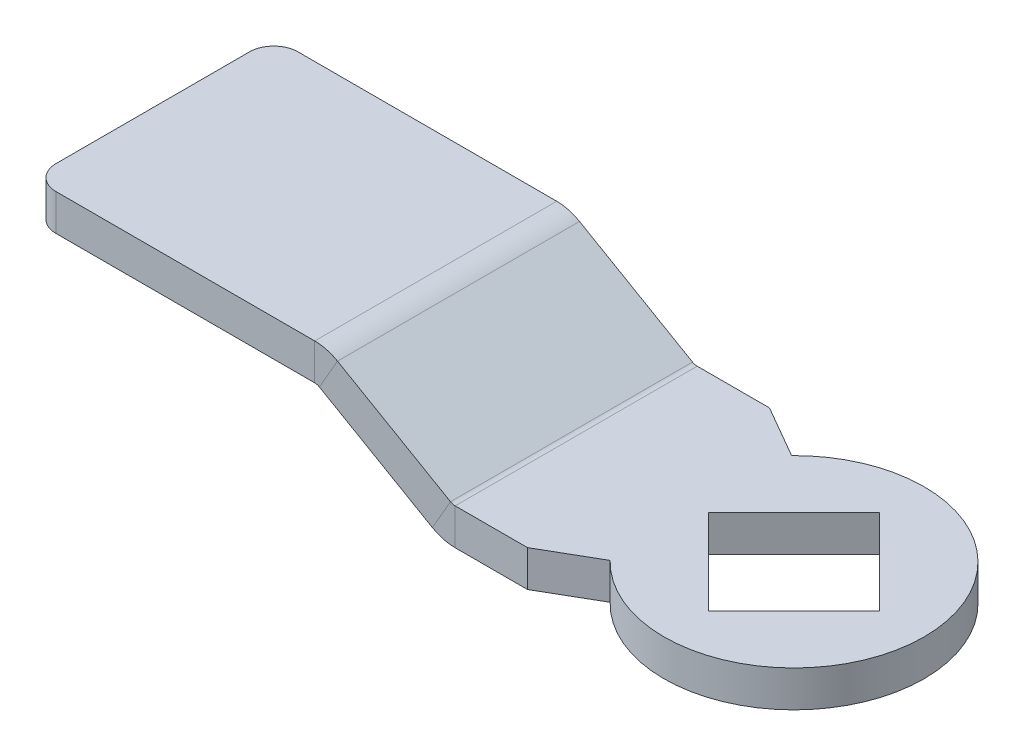
ISO-10303-21;
HEADER;
FILE_DESCRIPTION(('STEP AP214'),'2;1');
FILE_NAME('part.step','',(''),(''),'','','');
FILE_SCHEMA(('AUTOMOTIVE_DESIGN { 1 0 10303 214 1 1 1 1 }'));
ENDSEC;
DATA;
#1=APPLICATION_CONTEXT('core data for automotive mechanical design processes');
#2=APPLICATION_PROTOCOL_DEFINITION('international standard','automotive_design',2000,#1);
#3=PRODUCT_CONTEXT('',#1,'mechanical');
#4=PRODUCT('Part','Part','',(#3));
#5=PRODUCT_RELATED_PRODUCT_CATEGORY('part','',(#4));
#6=PRODUCT_DEFINITION_FORMATION('','',#4);
#7=PRODUCT_DEFINITION_CONTEXT('part definition',#1,'design');
#8=PRODUCT_DEFINITION('design','',#6,#7);
#9=PRODUCT_DEFINITION_SHAPE('','',#8);
#10=(LENGTH_UNIT() NAMED_UNIT(*) SI_UNIT(.MILLI.,.METRE.));
#11=(NAMED_UNIT(*) PLANE_ANGLE_UNIT() SI_UNIT($,.RADIAN.));
#12=(NAMED_UNIT(*) SI_UNIT($,.STERADIAN.) SOLID_ANGLE_UNIT());
#13=UNCERTAINTY_MEASURE_WITH_UNIT(LENGTH_MEASURE(1.E-05),#10,'distance_accuracy_value','');
#14=(GEOMETRIC_REPRESENTATION_CONTEXT(3) GLOBAL_UNCERTAINTY_ASSIGNED_CONTEXT((#13)) GLOBAL_UNIT_ASSIGNED_CONTEXT((#10,
#11,#12)) REPRESENTATION_CONTEXT('',''));
#15=CARTESIAN_POINT('',(0.,0.,0.));
#16=DIRECTION('',(0.,0.,1.));
#17=DIRECTION('',(1.,0.,0.));
#18=AXIS2_PLACEMENT_3D('',#15,#16,#17);
#19=CARTESIAN_POINT('',(-3.26800766572052,-12.0923274370223,0.));
#20=DIRECTION('',(0.500000000000001,0.866025403784438,0.));
#21=DIRECTION('',(0.,0.,1.));
#22=AXIS2_PLACEMENT_3D('',#19,#20,#21);
#23=PLANE('',#22);
#24=DIRECTION('',(0.866025403784438,-0.500000000000001,0.));
#25=VECTOR('',#24,1.);
#26=CARTESIAN_POINT('',(-49.1673540662957,14.4076725629777,10.));
#27=LINE('',#26,#25);
#28=CARTESIAN_POINT('',(-29.2307954420266,2.89729507454116,10.));
#29=VERTEX_POINT('',#28);
#30=CARTESIAN_POINT('',(-19.8904233174846,-2.49537128589446,10.));
#31=VERTEX_POINT('',#30);
#32=EDGE_CURVE('E347',#29,#31,#27,.T.);
#33=ORIENTED_EDGE('',*,*,#32,.F.);
#34=DIRECTION('',(0.,0.,-1.));
#35=VECTOR('',#34,1.);
#36=CARTESIAN_POINT('',(-29.2307954420266,2.89729507454116,0.));
#37=LINE('',#36,#35);
#38=CARTESIAN_POINT('',(-29.2307954420266,2.89729507454116,-9.99999999999999));
#39=VERTEX_POINT('',#38);
#40=EDGE_CURVE('E333',#29,#39,#37,.T.);
#41=ORIENTED_EDGE('',*,*,#40,.T.);
#42=DIRECTION('',(-0.866025403784438,0.500000000000001,0.));
#43=VECTOR('',#42,1.);
#44=CARTESIAN_POINT('',(-49.1673540662957,14.4076725629777,-10.));
#45=LINE('',#44,#43);
#46=CARTESIAN_POINT('',(-19.8904233174846,-2.49537128589446,-10.));
#47=VERTEX_POINT('',#46);
#48=EDGE_CURVE('E277',#47,#39,#45,.T.);
#49=ORIENTED_EDGE('',*,*,#48,.F.);
#50=DIRECTION('',(0.,0.,-1.));
#51=VECTOR('',#50,1.);
#52=CARTESIAN_POINT('',(-19.8904233174846,-2.49537128589446,0.));
#53=LINE('',#52,#51);
#54=EDGE_CURVE('E321',#31,#47,#53,.T.);
#55=ORIENTED_EDGE('',*,*,#54,.F.);
#56=EDGE_LOOP('',(#33,#41,#49,#55));
#57=FACE_BOUND('',#56,.T.);
#58=ADVANCED_FACE('F43',(#57),#23,.F.);
#59=CARTESIAN_POINT('',(-49.1673540662957,14.4076725629777,-10.));
#60=DIRECTION('',(0.,0.,-1.));
#61=DIRECTION('',(-0.866025403784438,0.500000000000001,0.));
#62=AXIS2_PLACEMENT_3D('',#59,#60,#61);
#63=PLANE('',#62);
#64=DIRECTION('',(-0.500000000000001,-0.866025403784438,0.));
#65=VECTOR('',#64,1.);
#66=CARTESIAN_POINT('',(-29.2307954420266,2.89729507454116,-10.));
#67=LINE('',#66,#65);
#68=CARTESIAN_POINT('',(-27.7307954420266,5.49537128589447,-10.));
#69=VERTEX_POINT('',#68);
#70=EDGE_CURVE('E342',#69,#39,#67,.T.);
#71=ORIENTED_EDGE('',*,*,#70,.F.);
#72=DIRECTION('',(-0.866025403784438,0.500000000000001,0.));
#73=VECTOR('',#72,1.);
#74=CARTESIAN_POINT('',(-47.6673540662957,17.005748774331,-10.));
#75=LINE('',#74,#73);
#76=CARTESIAN_POINT('',(-18.3904233174846,0.102704925458851,-10.));
#77=VERTEX_POINT('',#76);
#78=EDGE_CURVE('E325',#77,#69,#75,.T.);
#79=ORIENTED_EDGE('',*,*,#78,.F.);
#80=DIRECTION('',(-0.500000000000001,-0.866025403784438,0.));
#81=VECTOR('',#80,1.);
#82=CARTESIAN_POINT('',(-19.8904233174846,-2.49537128589446,-10.));
#83=LINE('',#82,#81);
#84=EDGE_CURVE('E324',#77,#47,#83,.T.);
#85=ORIENTED_EDGE('',*,*,#84,.T.);
#86=ORIENTED_EDGE('',*,*,#48,.T.);
#87=EDGE_LOOP('',(#71,#79,#85,#86));
#88=FACE_BOUND('',#87,.T.);
#89=ADVANCED_FACE('F404',(#88),#63,.T.);
#90=CARTESIAN_POINT('',(-49.1673540662957,14.4076725629777,10.));
#91=DIRECTION('',(0.,0.,1.));
#92=DIRECTION('',(0.866025403784438,-0.500000000000001,0.));
#93=AXIS2_PLACEMENT_3D('',#90,#91,#92);
#94=PLANE('',#93);
#95=DIRECTION('',(0.500000000000001,0.866025403784438,0.));
#96=VECTOR('',#95,1.);
#97=CARTESIAN_POINT('',(-29.2307954420266,2.89729507454116,10.));
#98=LINE('',#97,#96);
#99=CARTESIAN_POINT('',(-27.7307954420266,5.49537128589447,10.));
#100=VERTEX_POINT('',#99);
#101=EDGE_CURVE('E336',#29,#100,#98,.T.);
#102=ORIENTED_EDGE('',*,*,#101,.F.);
#103=ORIENTED_EDGE('',*,*,#32,.T.);
#104=DIRECTION('',(0.500000000000001,0.866025403784438,0.));
#105=VECTOR('',#104,1.);
#106=CARTESIAN_POINT('',(-19.8904233174846,-2.49537128589446,10.));
#107=LINE('',#106,#105);
#108=CARTESIAN_POINT('',(-18.3904233174846,0.102704925458851,10.));
#109=VERTEX_POINT('',#108);
#110=EDGE_CURVE('E330',#31,#109,#107,.T.);
#111=ORIENTED_EDGE('',*,*,#110,.T.);
#112=DIRECTION('',(0.866025403784438,-0.500000000000001,0.));
#113=VECTOR('',#112,1.);
#114=CARTESIAN_POINT('',(-47.6673540662957,17.005748774331,10.));
#115=LINE('',#114,#113);
#116=EDGE_CURVE('E349',#100,#109,#115,.T.);
#117=ORIENTED_EDGE('',*,*,#116,.F.);
#118=EDGE_LOOP('',(#102,#103,#111,#117));
#119=FACE_BOUND('',#118,.T.);
#120=ADVANCED_FACE('F394',(#119),#94,.T.);
#121=CARTESIAN_POINT('',(-1.76800766572051,-9.49425122566903,0.));
#122=DIRECTION('',(0.500000000000001,0.866025403784438,0.));
#123=DIRECTION('',(0.,0.,1.));
#124=AXIS2_PLACEMENT_3D('',#121,#122,#123);
#125=PLANE('',#124);
#126=DIRECTION('',(0.,0.,-1.));
#127=VECTOR('',#126,1.);
#128=CARTESIAN_POINT('',(-27.7307954420266,5.49537128589447,0.));
#129=LINE('',#128,#127);
#130=EDGE_CURVE('E339',#100,#69,#129,.T.);
#131=ORIENTED_EDGE('',*,*,#130,.F.);
#132=ORIENTED_EDGE('',*,*,#116,.T.);
#133=DIRECTION('',(0.,0.,-1.));
#134=VECTOR('',#133,1.);
#135=CARTESIAN_POINT('',(-18.3904233174846,0.102704925458851,0.));
#136=LINE('',#135,#134);
#137=EDGE_CURVE('E327',#109,#77,#136,.T.);
#138=ORIENTED_EDGE('',*,*,#137,.T.);
#139=ORIENTED_EDGE('',*,*,#78,.T.);
#140=EDGE_LOOP('',(#131,#132,#138,#139));
#141=FACE_BOUND('',#140,.T.);
#142=ADVANCED_FACE('F400',(#141),#125,.T.);
#143=CARTESIAN_POINT('',(-12.0315879192969,-3.,9.99999999999999));
#144=DIRECTION('',(0.500000000000001,0.,0.866025403784438));
#145=DIRECTION('',(0.866025403784438,0.,-0.500000000000001));
#146=AXIS2_PLACEMENT_3D('',#143,#144,#145);
#147=PLANE('',#146);
#148=DIRECTION('',(0.866025403784438,0.,-0.500000000000001));
#149=VECTOR('',#148,1.);
#150=CARTESIAN_POINT('',(-12.0315879192969,0.,9.99999999999999));
#151=LINE('',#150,#149);
#152=CARTESIAN_POINT('',(-12.0315879192969,0.,9.99999999999999));
#153=VERTEX_POINT('',#152);
#154=CARTESIAN_POINT('',(-7.70146090037469,0.,7.5));
#155=VERTEX_POINT('',#154);
#156=EDGE_CURVE('E288',#153,#155,#151,.T.);
#157=ORIENTED_EDGE('',*,*,#156,.F.);
#158=DIRECTION('',(0.,1.,0.));
#159=VECTOR('',#158,1.);
#160=CARTESIAN_POINT('',(-12.0315879192969,-3.,9.99999999999999));
#161=LINE('',#160,#159);
#162=CARTESIAN_POINT('',(-12.0315879192969,-3.,9.99999999999999));
#163=VERTEX_POINT('',#162);
#164=EDGE_CURVE('E274',#163,#153,#161,.T.);
#165=ORIENTED_EDGE('',*,*,#164,.F.);
#166=DIRECTION('',(0.866025403784438,0.,-0.500000000000001));
#167=VECTOR('',#166,1.);
#168=CARTESIAN_POINT('',(-12.0315879192969,-3.,9.99999999999999));
#169=LINE('',#168,#167);
#170=CARTESIAN_POINT('',(-7.70146090037469,-3.,7.5));
#171=VERTEX_POINT('',#170);
#172=EDGE_CURVE('E310',#163,#171,#169,.T.);
#173=ORIENTED_EDGE('',*,*,#172,.T.);
#174=DIRECTION('',(0.,1.,0.));
#175=VECTOR('',#174,1.);
#176=CARTESIAN_POINT('',(-7.70146090037469,-3.,7.5));
#177=LINE('',#176,#175);
#178=EDGE_CURVE('E308',#171,#155,#177,.T.);
#179=ORIENTED_EDGE('',*,*,#178,.T.);
#180=EDGE_LOOP('',(#157,#165,#173,#179));
#181=FACE_BOUND('',#180,.T.);
#182=ADVANCED_FACE('F440',(#181),#147,.T.);
#183=CARTESIAN_POINT('',(0.,-3.,0.));
#184=DIRECTION('',(0.,1.,0.));
#185=DIRECTION('',(0.,0.,1.));
#186=AXIS2_PLACEMENT_3D('',#183,#184,#185);
#187=CYLINDRICAL_SURFACE('',#186,10.75);
#188=CARTESIAN_POINT('',(0.,0.,0.));
#189=DIRECTION('',(0.,1.,0.));
#190=DIRECTION('',(0.,0.,1.));
#191=AXIS2_PLACEMENT_3D('',#188,#189,#190);
#192=CIRCLE('',#191,10.75);
#193=CARTESIAN_POINT('',(-7.70146090037469,0.,-7.49999999999999));
#194=VERTEX_POINT('',#193);
#195=EDGE_CURVE('E285',#155,#194,#192,.T.);
#196=ORIENTED_EDGE('',*,*,#195,.F.);
#197=ORIENTED_EDGE('',*,*,#178,.F.);
#198=CARTESIAN_POINT('',(0.,-3.,0.));
#199=DIRECTION('',(0.,1.,0.));
#200=DIRECTION('',(0.,0.,1.));
#201=AXIS2_PLACEMENT_3D('',#198,#199,#200);
#202=CIRCLE('',#201,10.75);
#203=CARTESIAN_POINT('',(-7.70146090037469,-3.,-7.49999999999999));
#204=VERTEX_POINT('',#203);
#205=EDGE_CURVE('E305',#171,#204,#202,.T.);
#206=ORIENTED_EDGE('',*,*,#205,.T.);
#207=DIRECTION('',(0.,1.,0.));
#208=VECTOR('',#207,1.);
#209=CARTESIAN_POINT('',(-7.70146090037469,-3.,-7.49999999999999));
#210=LINE('',#209,#208);
#211=EDGE_CURVE('E303',#204,#194,#210,.T.);
#212=ORIENTED_EDGE('',*,*,#211,.T.);
#213=EDGE_LOOP('',(#196,#197,#206,#212));
#214=FACE_BOUND('',#213,.T.);
#215=ADVANCED_FACE('F437',(#214),#187,.T.);
#216=CARTESIAN_POINT('',(-12.0315879192969,-3.,-9.99999999999999));
#217=DIRECTION('',(0.500000000000001,0.,-0.866025403784438));
#218=DIRECTION('',(-0.866025403784438,0.,-0.500000000000001));
#219=AXIS2_PLACEMENT_3D('',#216,#217,#218);
#220=PLANE('',#219);
#221=DIRECTION('',(-0.866025403784438,0.,-0.500000000000001));
#222=VECTOR('',#221,1.);
#223=CARTESIAN_POINT('',(-12.0315879192969,0.,-9.99999999999999));
#224=LINE('',#223,#222);
#225=CARTESIAN_POINT('',(-12.0315879192969,0.,-9.99999999999999));
#226=VERTEX_POINT('',#225);
#227=EDGE_CURVE('E282',#194,#226,#224,.T.);
#228=ORIENTED_EDGE('',*,*,#227,.F.);
#229=ORIENTED_EDGE('',*,*,#211,.F.);
#230=DIRECTION('',(-0.866025403784438,0.,-0.500000000000001));
#231=VECTOR('',#230,1.);
#232=CARTESIAN_POINT('',(-12.0315879192969,-3.,-9.99999999999999));
#233=LINE('',#232,#231);
#234=CARTESIAN_POINT('',(-12.0315879192969,-3.,-9.99999999999999));
#235=VERTEX_POINT('',#234);
#236=EDGE_CURVE('E300',#204,#235,#233,.T.);
#237=ORIENTED_EDGE('',*,*,#236,.T.);
#238=DIRECTION('',(0.,1.,0.));
#239=VECTOR('',#238,1.);
#240=CARTESIAN_POINT('',(-12.0315879192969,-3.,-9.99999999999999));
#241=LINE('',#240,#239);
#242=EDGE_CURVE('E298',#235,#226,#241,.T.);
#243=ORIENTED_EDGE('',*,*,#242,.T.);
#244=EDGE_LOOP('',(#228,#229,#237,#243));
#245=FACE_BOUND('',#244,.T.);
#246=ADVANCED_FACE('F433',(#245),#220,.T.);
#247=CARTESIAN_POINT('',(0.,-3.,0.));
#248=DIRECTION('',(0.,1.,0.));
#249=DIRECTION('',(0.,0.,1.));
#250=AXIS2_PLACEMENT_3D('',#247,#248,#249);
#251=PLANE('',#250);
#252=DIRECTION('',(0.707106781186548,0.,-0.707106781186548));
#253=VECTOR('',#252,1.);
#254=CARTESIAN_POINT('',(0.,-3.,7.07106781186547));
#255=LINE('',#254,#253);
#256=CARTESIAN_POINT('',(0.,-3.,7.07106781186547));
#257=VERTEX_POINT('',#256);
#258=CARTESIAN_POINT('',(7.07106781186548,-3.,0.));
#259=VERTEX_POINT('',#258);
#260=EDGE_CURVE('E192',#257,#259,#255,.T.);
#261=ORIENTED_EDGE('',*,*,#260,.T.);
#262=DIRECTION('',(-0.707106781186548,0.,-0.707106781186548));
#263=VECTOR('',#262,1.);
#264=CARTESIAN_POINT('',(7.07106781186548,-3.,0.));
#265=LINE('',#264,#263);
#266=CARTESIAN_POINT('',(0.,-3.,-7.07106781186548));
#267=VERTEX_POINT('',#266);
#268=EDGE_CURVE('E184',#259,#267,#265,.T.);
#269=ORIENTED_EDGE('',*,*,#268,.T.);
#270=DIRECTION('',(-0.707106781186548,0.,0.707106781186548));
#271=VECTOR('',#270,1.);
#272=CARTESIAN_POINT('',(0.,-3.,-7.07106781186548));
#273=LINE('',#272,#271);
#274=CARTESIAN_POINT('',(-7.07106781186548,-3.,0.));
#275=VERTEX_POINT('',#274);
#276=EDGE_CURVE('E196',#267,#275,#273,.T.);
#277=ORIENTED_EDGE('',*,*,#276,.T.);
#278=DIRECTION('',(0.707106781186548,0.,0.707106781186548));
#279=VECTOR('',#278,1.);
#280=CARTESIAN_POINT('',(-7.07106781186548,-3.,0.));
#281=LINE('',#280,#279);
#282=EDGE_CURVE('E200',#275,#257,#281,.T.);
#283=ORIENTED_EDGE('',*,*,#282,.T.);
#284=EDGE_LOOP('',(#261,#269,#277,#283));
#285=FACE_BOUND('',#284,.T.);
#286=DIRECTION('',(1.,0.,0.));
#287=VECTOR('',#286,1.);
#288=CARTESIAN_POINT('',(-53.,-3.,10.));
#289=LINE('',#288,#287);
#290=CARTESIAN_POINT('',(-18.0071233174846,-3.,9.99999999999999));
#291=VERTEX_POINT('',#290);
#292=EDGE_CURVE('E278',#291,#163,#289,.T.);
#293=ORIENTED_EDGE('',*,*,#292,.F.);
#294=DIRECTION('',(0.,0.,-1.));
#295=VECTOR('',#294,1.);
#296=CARTESIAN_POINT('',(-18.0071233174846,-3.,0.));
#297=LINE('',#296,#295);
#298=CARTESIAN_POINT('',(-18.0071233174846,-3.,-9.99999999999999));
#299=VERTEX_POINT('',#298);
#300=EDGE_CURVE('E295',#291,#299,#297,.T.);
#301=ORIENTED_EDGE('',*,*,#300,.T.);
#302=DIRECTION('',(-1.,0.,0.));
#303=VECTOR('',#302,1.);
#304=CARTESIAN_POINT('',(-53.,-3.,-10.));
#305=LINE('',#304,#303);
#306=EDGE_CURVE('E293',#235,#299,#305,.T.);
#307=ORIENTED_EDGE('',*,*,#306,.F.);
#308=ORIENTED_EDGE('',*,*,#236,.F.);
#309=ORIENTED_EDGE('',*,*,#205,.F.);
#310=ORIENTED_EDGE('',*,*,#172,.F.);
#311=EDGE_LOOP('',(#293,#301,#307,#308,#309,#310));
#312=FACE_BOUND('',#311,.T.);
#313=ADVANCED_FACE('F202',(#285,#312),#251,.F.);
#314=CARTESIAN_POINT('',(-53.,-3.,-10.));
#315=DIRECTION('',(0.,0.,-1.));
#316=DIRECTION('',(-1.,0.,0.));
#317=AXIS2_PLACEMENT_3D('',#314,#315,#316);
#318=PLANE('',#317);
#319=DIRECTION('',(0.,-1.,0.));
#320=VECTOR('',#319,1.);
#321=CARTESIAN_POINT('',(-18.0071233174846,-3.,-9.99999999999999));
#322=LINE('',#321,#320);
#323=CARTESIAN_POINT('',(-18.0071233174846,0.,-9.99999999999999));
#324=VERTEX_POINT('',#323);
#325=EDGE_CURVE('E313',#324,#299,#322,.T.);
#326=ORIENTED_EDGE('',*,*,#325,.F.);
#327=DIRECTION('',(-1.,0.,0.));
#328=VECTOR('',#327,1.);
#329=CARTESIAN_POINT('',(-53.,0.,-10.));
#330=LINE('',#329,#328);
#331=EDGE_CURVE('E280',#226,#324,#330,.T.);
#332=ORIENTED_EDGE('',*,*,#331,.F.);
#333=ORIENTED_EDGE('',*,*,#242,.F.);
#334=ORIENTED_EDGE('',*,*,#306,.T.);
#335=EDGE_LOOP('',(#326,#332,#333,#334));
#336=FACE_BOUND('',#335,.T.);
#337=ADVANCED_FACE('F430',(#336),#318,.T.);
#338=CARTESIAN_POINT('',(0.,0.,0.));
#339=DIRECTION('',(0.,1.,0.));
#340=DIRECTION('',(0.,0.,1.));
#341=AXIS2_PLACEMENT_3D('',#338,#339,#340);
#342=PLANE('',#341);
#343=DIRECTION('',(-0.707106781186548,0.,-0.707106781186548));
#344=VECTOR('',#343,1.);
#345=CARTESIAN_POINT('',(7.07106781186548,0.,0.));
#346=LINE('',#345,#344);
#347=CARTESIAN_POINT('',(7.07106781186548,0.,0.));
#348=VERTEX_POINT('',#347);
#349=CARTESIAN_POINT('',(0.,0.,-7.07106781186548));
#350=VERTEX_POINT('',#349);
#351=EDGE_CURVE('E187',#348,#350,#346,.T.);
#352=ORIENTED_EDGE('',*,*,#351,.F.);
#353=DIRECTION('',(0.707106781186548,0.,-0.707106781186548));
#354=VECTOR('',#353,1.);
#355=CARTESIAN_POINT('',(0.,0.,7.07106781186547));
#356=LINE('',#355,#354);
#357=CARTESIAN_POINT('',(0.,0.,7.07106781186547));
#358=VERTEX_POINT('',#357);
#359=EDGE_CURVE('E205',#358,#348,#356,.T.);
#360=ORIENTED_EDGE('',*,*,#359,.F.);
#361=DIRECTION('',(0.707106781186548,0.,0.707106781186548));
#362=VECTOR('',#361,1.);
#363=CARTESIAN_POINT('',(-7.07106781186548,0.,0.));
#364=LINE('',#363,#362);
#365=CARTESIAN_POINT('',(-7.07106781186548,0.,0.));
#366=VERTEX_POINT('',#365);
#367=EDGE_CURVE('E208',#366,#358,#364,.T.);
#368=ORIENTED_EDGE('',*,*,#367,.F.);
#369=DIRECTION('',(-0.707106781186548,0.,0.707106781186548));
#370=VECTOR('',#369,1.);
#371=CARTESIAN_POINT('',(0.,0.,-7.07106781186548));
#372=LINE('',#371,#370);
#373=EDGE_CURVE('E214',#350,#366,#372,.T.);
#374=ORIENTED_EDGE('',*,*,#373,.F.);
#375=EDGE_LOOP('',(#352,#360,#368,#374));
#376=FACE_BOUND('',#375,.T.);
#377=DIRECTION('',(0.,0.,-1.));
#378=VECTOR('',#377,1.);
#379=CARTESIAN_POINT('',(-18.0071233174846,0.,0.));
#380=LINE('',#379,#378);
#381=CARTESIAN_POINT('',(-18.0071233174846,0.,9.99999999999999));
#382=VERTEX_POINT('',#381);
#383=EDGE_CURVE('E316',#382,#324,#380,.T.);
#384=ORIENTED_EDGE('',*,*,#383,.F.);
#385=DIRECTION('',(1.,0.,0.));
#386=VECTOR('',#385,1.);
#387=CARTESIAN_POINT('',(-53.,0.,10.));
#388=LINE('',#387,#386);
#389=EDGE_CURVE('E291',#382,#153,#388,.T.);
#390=ORIENTED_EDGE('',*,*,#389,.T.);
#391=ORIENTED_EDGE('',*,*,#156,.T.);
#392=ORIENTED_EDGE('',*,*,#195,.T.);
#393=ORIENTED_EDGE('',*,*,#227,.T.);
#394=ORIENTED_EDGE('',*,*,#331,.T.);
#395=EDGE_LOOP('',(#384,#390,#391,#392,#393,#394));
#396=FACE_BOUND('',#395,.T.);
#397=ADVANCED_FACE('F448',(#376,#396),#342,.T.);
#398=CARTESIAN_POINT('',(-53.,-3.,10.));
#399=DIRECTION('',(0.,0.,1.));
#400=DIRECTION('',(1.,0.,0.));
#401=AXIS2_PLACEMENT_3D('',#398,#399,#400);
#402=PLANE('',#401);
#403=DIRECTION('',(0.,1.,0.));
#404=VECTOR('',#403,1.);
#405=CARTESIAN_POINT('',(-18.0071233174846,-3.,9.99999999999999));
#406=LINE('',#405,#404);
#407=EDGE_CURVE('E269',#291,#382,#406,.T.);
#408=ORIENTED_EDGE('',*,*,#407,.F.);
#409=ORIENTED_EDGE('',*,*,#292,.T.);
#410=ORIENTED_EDGE('',*,*,#164,.T.);
#411=ORIENTED_EDGE('',*,*,#389,.F.);
#412=EDGE_LOOP('',(#408,#409,#410,#411));
#413=FACE_BOUND('',#412,.T.);
#414=ADVANCED_FACE('F443',(#413),#402,.T.);
#415=CARTESIAN_POINT('',(-18.0071233174846,0.7666,9.99999999999999));
#416=DIRECTION('',(0.,0.,1.));
#417=DIRECTION('',(1.,0.,0.));
#418=AXIS2_PLACEMENT_3D('',#415,#416,#417);
#419=PLANE('',#418);
#420=ORIENTED_EDGE('',*,*,#407,.T.);
#421=CARTESIAN_POINT('',(-18.0071233174846,0.7666,9.99999999999999));
#422=DIRECTION('',(0.,0.,-1.));
#423=DIRECTION('',(-1.,0.,0.));
#424=AXIS2_PLACEMENT_3D('',#421,#422,#423);
#425=CIRCLE('',#424,0.7666);
#426=EDGE_CURVE('E257',#382,#109,#425,.T.);
#427=ORIENTED_EDGE('',*,*,#426,.T.);
#428=ORIENTED_EDGE('',*,*,#110,.F.);
#429=CARTESIAN_POINT('',(-18.0071233174846,0.7666,9.99999999999999));
#430=DIRECTION('',(0.,0.,-1.));
#431=DIRECTION('',(1.,0.,0.));
#432=AXIS2_PLACEMENT_3D('',#429,#430,#431);
#433=CIRCLE('',#432,3.7666);
#434=EDGE_CURVE('E262',#291,#31,#433,.T.);
#435=ORIENTED_EDGE('',*,*,#434,.F.);
#436=EDGE_LOOP('',(#420,#427,#428,#435));
#437=FACE_BOUND('',#436,.T.);
#438=ADVANCED_FACE('F416',(#437),#419,.T.);
#439=CARTESIAN_POINT('',(-18.0071233174846,0.7666,-9.99999999999999));
#440=DIRECTION('',(0.,0.,-1.));
#441=DIRECTION('',(-1.,0.,0.));
#442=AXIS2_PLACEMENT_3D('',#439,#440,#441);
#443=PLANE('',#442);
#444=ORIENTED_EDGE('',*,*,#84,.F.);
#445=CARTESIAN_POINT('',(-18.0071233174846,0.7666,-10.));
#446=DIRECTION('',(0.,0.,-1.));
#447=DIRECTION('',(-1.,0.,0.));
#448=AXIS2_PLACEMENT_3D('',#445,#446,#447);
#449=CIRCLE('',#448,0.7666);
#450=EDGE_CURVE('E266',#77,#324,#449,.F.);
#451=ORIENTED_EDGE('',*,*,#450,.T.);
#452=ORIENTED_EDGE('',*,*,#325,.T.);
#453=CARTESIAN_POINT('',(-18.0071233174846,0.7666,-9.99999999999999));
#454=DIRECTION('',(0.,0.,1.));
#455=DIRECTION('',(-1.,0.,0.));
#456=AXIS2_PLACEMENT_3D('',#453,#454,#455);
#457=CIRCLE('',#456,3.7666);
#458=EDGE_CURVE('E265',#47,#299,#457,.T.);
#459=ORIENTED_EDGE('',*,*,#458,.F.);
#460=EDGE_LOOP('',(#444,#451,#452,#459));
#461=FACE_BOUND('',#460,.T.);
#462=ADVANCED_FACE('F426',(#461),#443,.T.);
#463=CARTESIAN_POINT('',(-18.0071233174846,0.7666,20.2585406210411));
#464=DIRECTION('',(0.,0.,-1.));
#465=DIRECTION('',(-1.,0.,0.));
#466=AXIS2_PLACEMENT_3D('',#463,#464,#465);
#467=CYLINDRICAL_SURFACE('',#466,3.7666);
#468=ORIENTED_EDGE('',*,*,#458,.T.);
#469=ORIENTED_EDGE('',*,*,#300,.F.);
#470=ORIENTED_EDGE('',*,*,#434,.T.);
#471=ORIENTED_EDGE('',*,*,#54,.T.);
#472=EDGE_LOOP('',(#468,#469,#470,#471));
#473=FACE_BOUND('',#472,.T.);
#474=ADVANCED_FACE('F419',(#473),#467,.T.);
#475=CARTESIAN_POINT('',(-18.0071233174846,0.7666,20.2585406210411));
#476=DIRECTION('',(0.,0.,-1.));
#477=DIRECTION('',(-1.,0.,0.));
#478=AXIS2_PLACEMENT_3D('',#475,#476,#477);
#479=CYLINDRICAL_SURFACE('',#478,0.7666);
#480=ORIENTED_EDGE('',*,*,#450,.F.);
#481=ORIENTED_EDGE('',*,*,#137,.F.);
#482=ORIENTED_EDGE('',*,*,#426,.F.);
#483=ORIENTED_EDGE('',*,*,#383,.T.);
#484=EDGE_LOOP('',(#480,#481,#482,#483));
#485=FACE_BOUND('',#484,.T.);
#486=ADVANCED_FACE('F446',(#485),#479,.F.);
#487=CARTESIAN_POINT('',(-29.6140954420266,2.23340000000001,10.));
#488=DIRECTION('',(0.,0.,-1.));
#489=DIRECTION('',(-1.,0.,0.));
#490=AXIS2_PLACEMENT_3D('',#487,#488,#489);
#491=PLANE('',#490);
#492=ORIENTED_EDGE('',*,*,#101,.T.);
#493=CARTESIAN_POINT('',(-29.6140954420266,2.23340000000001,10.));
#494=DIRECTION('',(0.,0.,-1.));
#495=DIRECTION('',(-1.,0.,0.));
#496=AXIS2_PLACEMENT_3D('',#493,#494,#495);
#497=CIRCLE('',#496,3.7666);
#498=CARTESIAN_POINT('',(-29.6140954420266,6.00000000000001,10.));
#499=VERTEX_POINT('',#498);
#500=EDGE_CURVE('E227',#100,#499,#497,.F.);
#501=ORIENTED_EDGE('',*,*,#500,.T.);
#502=DIRECTION('',(0.,1.,0.));
#503=VECTOR('',#502,1.);
#504=CARTESIAN_POINT('',(-29.6140954420266,3.00000000000001,10.));
#505=LINE('',#504,#503);
#506=CARTESIAN_POINT('',(-29.6140954420266,3.00000000000001,10.));
#507=VERTEX_POINT('',#506);
#508=EDGE_CURVE('E241',#507,#499,#505,.T.);
#509=ORIENTED_EDGE('',*,*,#508,.F.);
#510=CARTESIAN_POINT('',(-29.6140954420266,2.23340000000001,10.));
#511=DIRECTION('',(0.,0.,1.));
#512=DIRECTION('',(-1.,0.,0.));
#513=AXIS2_PLACEMENT_3D('',#510,#511,#512);
#514=CIRCLE('',#513,0.7666);
#515=EDGE_CURVE('E250',#29,#507,#514,.T.);
#516=ORIENTED_EDGE('',*,*,#515,.F.);
#517=EDGE_LOOP('',(#492,#501,#509,#516));
#518=FACE_BOUND('',#517,.T.);
#519=ADVANCED_FACE('F390',(#518),#491,.F.);
#520=CARTESIAN_POINT('',(-29.6140954420266,2.23340000000001,-9.99999999999999));
#521=DIRECTION('',(0.,0.,1.));
#522=DIRECTION('',(1.,0.,0.));
#523=AXIS2_PLACEMENT_3D('',#520,#521,#522);
#524=PLANE('',#523);
#525=DIRECTION('',(0.,-1.,0.));
#526=VECTOR('',#525,1.);
#527=CARTESIAN_POINT('',(-29.6140954420266,3.00000000000001,-10.));
#528=LINE('',#527,#526);
#529=CARTESIAN_POINT('',(-29.6140954420266,6.00000000000001,-10.));
#530=VERTEX_POINT('',#529);
#531=CARTESIAN_POINT('',(-29.6140954420266,3.00000000000001,-9.99999999999999));
#532=VERTEX_POINT('',#531);
#533=EDGE_CURVE('E228',#530,#532,#528,.T.);
#534=ORIENTED_EDGE('',*,*,#533,.F.);
#535=CARTESIAN_POINT('',(-29.6140954420266,2.23340000000001,-9.99999999999999));
#536=DIRECTION('',(0.,0.,-1.));
#537=DIRECTION('',(-1.,0.,0.));
#538=AXIS2_PLACEMENT_3D('',#535,#536,#537);
#539=CIRCLE('',#538,3.7666);
#540=EDGE_CURVE('E254',#530,#69,#539,.T.);
#541=ORIENTED_EDGE('',*,*,#540,.T.);
#542=ORIENTED_EDGE('',*,*,#70,.T.);
#543=CARTESIAN_POINT('',(-29.6140954420266,2.23340000000001,-9.99999999999999));
#544=DIRECTION('',(0.,0.,-1.));
#545=DIRECTION('',(1.,0.,0.));
#546=AXIS2_PLACEMENT_3D('',#543,#544,#545);
#547=CIRCLE('',#546,0.7666);
#548=EDGE_CURVE('E253',#532,#39,#547,.T.);
#549=ORIENTED_EDGE('',*,*,#548,.F.);
#550=EDGE_LOOP('',(#534,#541,#542,#549));
#551=FACE_BOUND('',#550,.T.);
#552=ADVANCED_FACE('F408',(#551),#524,.F.);
#553=CARTESIAN_POINT('',(-29.6140954420266,2.23340000000001,20.4101740451382));
#554=DIRECTION('',(0.,0.,-1.));
#555=DIRECTION('',(-1.,0.,0.));
#556=AXIS2_PLACEMENT_3D('',#553,#554,#555);
#557=CYLINDRICAL_SURFACE('',#556,0.7666);
#558=ORIENTED_EDGE('',*,*,#548,.T.);
#559=ORIENTED_EDGE('',*,*,#40,.F.);
#560=ORIENTED_EDGE('',*,*,#515,.T.);
#561=DIRECTION('',(0.,0.,-1.));
#562=VECTOR('',#561,1.);
#563=CARTESIAN_POINT('',(-29.6140954420266,3.00000000000001,0.));
#564=LINE('',#563,#562);
#565=EDGE_CURVE('E220',#507,#532,#564,.T.);
#566=ORIENTED_EDGE('',*,*,#565,.T.);
#567=EDGE_LOOP('',(#558,#559,#560,#566));
#568=FACE_BOUND('',#567,.T.);
#569=ADVANCED_FACE('F410',(#568),#557,.F.);
#570=CARTESIAN_POINT('',(-29.6140954420266,2.23340000000001,20.4101740451382));
#571=DIRECTION('',(0.,0.,-1.));
#572=DIRECTION('',(-1.,0.,0.));
#573=AXIS2_PLACEMENT_3D('',#570,#571,#572);
#574=CYLINDRICAL_SURFACE('',#573,3.7666);
#575=ORIENTED_EDGE('',*,*,#540,.F.);
#576=DIRECTION('',(0.,0.,-1.));
#577=VECTOR('',#576,1.);
#578=CARTESIAN_POINT('',(-29.6140954420266,6.00000000000001,0.));
#579=LINE('',#578,#577);
#580=EDGE_CURVE('E236',#499,#530,#579,.T.);
#581=ORIENTED_EDGE('',*,*,#580,.F.);
#582=ORIENTED_EDGE('',*,*,#500,.F.);
#583=ORIENTED_EDGE('',*,*,#130,.T.);
#584=EDGE_LOOP('',(#575,#581,#582,#583));
#585=FACE_BOUND('',#584,.T.);
#586=ADVANCED_FACE('F389',(#585),#574,.T.);
#587=CARTESIAN_POINT('',(-53.,3.,-10.));
#588=DIRECTION('',(-1.,0.,0.));
#589=DIRECTION('',(0.,0.,1.));
#590=AXIS2_PLACEMENT_3D('',#587,#588,#589);
#591=PLANE('',#590);
#592=DIRECTION('',(0.,0.,1.));
#593=VECTOR('',#592,1.);
#594=CARTESIAN_POINT('',(-53.,6.00000000000001,-10.));
#595=LINE('',#594,#593);
#596=CARTESIAN_POINT('',(-53.,6.00000000000001,-8.));
#597=VERTEX_POINT('',#596);
#598=CARTESIAN_POINT('',(-53.,6.00000000000001,8.));
#599=VERTEX_POINT('',#598);
#600=EDGE_CURVE('E230',#597,#599,#595,.T.);
#601=ORIENTED_EDGE('',*,*,#600,.F.);
#602=DIRECTION('',(0.,1.,0.));
#603=VECTOR('',#602,1.);
#604=CARTESIAN_POINT('',(-53.,3.,-8.));
#605=LINE('',#604,#603);
#606=CARTESIAN_POINT('',(-53.,3.,-8.));
#607=VERTEX_POINT('',#606);
#608=EDGE_CURVE('E361',#597,#607,#605,.F.);
#609=ORIENTED_EDGE('',*,*,#608,.T.);
#610=DIRECTION('',(0.,0.,1.));
#611=VECTOR('',#610,1.);
#612=CARTESIAN_POINT('',(-53.,3.,-10.));
#613=LINE('',#612,#611);
#614=CARTESIAN_POINT('',(-53.,3.,8.));
#615=VERTEX_POINT('',#614);
#616=EDGE_CURVE('E246',#607,#615,#613,.T.);
#617=ORIENTED_EDGE('',*,*,#616,.T.);
#618=DIRECTION('',(0.,1.,0.));
#619=VECTOR('',#618,1.);
#620=CARTESIAN_POINT('',(-53.,3.,8.));
#621=LINE('',#620,#619);
#622=EDGE_CURVE('E358',#615,#599,#621,.T.);
#623=ORIENTED_EDGE('',*,*,#622,.T.);
#624=EDGE_LOOP('',(#601,#609,#617,#623));
#625=FACE_BOUND('',#624,.T.);
#626=ADVANCED_FACE('F378',(#625),#591,.T.);
#627=CARTESIAN_POINT('',(1.55193856587141,3.00000000000001,0.));
#628=DIRECTION('',(0.,1.,0.));
#629=DIRECTION('',(0.,0.,1.));
#630=AXIS2_PLACEMENT_3D('',#627,#628,#629);
#631=PLANE('',#630);
#632=ORIENTED_EDGE('',*,*,#616,.F.);
#633=CARTESIAN_POINT('',(-51.,3.00000000000001,-8.));
#634=DIRECTION('',(0.,1.,0.));
#635=DIRECTION('',(0.,0.,1.));
#636=AXIS2_PLACEMENT_3D('',#633,#634,#635);
#637=CIRCLE('',#636,2.);
#638=CARTESIAN_POINT('',(-51.,3.00000000000001,-10.));
#639=VERTEX_POINT('',#638);
#640=EDGE_CURVE('E51',#607,#639,#637,.F.);
#641=ORIENTED_EDGE('',*,*,#640,.T.);
#642=DIRECTION('',(-1.,0.,0.));
#643=VECTOR('',#642,1.);
#644=CARTESIAN_POINT('',(-51.4480614341286,3.00000000000001,-10.));
#645=LINE('',#644,#643);
#646=EDGE_CURVE('E224',#532,#639,#645,.T.);
#647=ORIENTED_EDGE('',*,*,#646,.F.);
#648=ORIENTED_EDGE('',*,*,#565,.F.);
#649=DIRECTION('',(1.,0.,0.));
#650=VECTOR('',#649,1.);
#651=CARTESIAN_POINT('',(-51.4480614341286,3.00000000000001,10.));
#652=LINE('',#651,#650);
#653=CARTESIAN_POINT('',(-51.,3.00000000000001,10.));
#654=VERTEX_POINT('',#653);
#655=EDGE_CURVE('E244',#654,#507,#652,.T.);
#656=ORIENTED_EDGE('',*,*,#655,.F.);
#657=CARTESIAN_POINT('',(-51.,3.00000000000001,8.));
#658=DIRECTION('',(0.,1.,0.));
#659=DIRECTION('',(0.,0.,1.));
#660=AXIS2_PLACEMENT_3D('',#657,#658,#659);
#661=CIRCLE('',#660,2.);
#662=EDGE_CURVE('E63',#654,#615,#661,.F.);
#663=ORIENTED_EDGE('',*,*,#662,.T.);
#664=EDGE_LOOP('',(#632,#641,#647,#648,#656,#663));
#665=FACE_BOUND('',#664,.T.);
#666=ADVANCED_FACE('F365',(#665),#631,.F.);
#667=CARTESIAN_POINT('',(-51.4480614341286,3.00000000000001,10.));
#668=DIRECTION('',(0.,0.,1.));
#669=DIRECTION('',(1.,0.,0.));
#670=AXIS2_PLACEMENT_3D('',#667,#668,#669);
#671=PLANE('',#670);
#672=DIRECTION('',(1.,0.,0.));
#673=VECTOR('',#672,1.);
#674=CARTESIAN_POINT('',(-51.4480614341286,6.00000000000001,10.));
#675=LINE('',#674,#673);
#676=CARTESIAN_POINT('',(-51.,6.00000000000001,10.));
#677=VERTEX_POINT('',#676);
#678=EDGE_CURVE('E239',#677,#499,#675,.T.);
#679=ORIENTED_EDGE('',*,*,#678,.F.);
#680=DIRECTION('',(0.,1.,0.));
#681=VECTOR('',#680,1.);
#682=CARTESIAN_POINT('',(-51.,3.00000000000001,10.));
#683=LINE('',#682,#681);
#684=EDGE_CURVE('E12',#677,#654,#683,.F.);
#685=ORIENTED_EDGE('',*,*,#684,.T.);
#686=ORIENTED_EDGE('',*,*,#655,.T.);
#687=ORIENTED_EDGE('',*,*,#508,.T.);
#688=EDGE_LOOP('',(#679,#685,#686,#687));
#689=FACE_BOUND('',#688,.T.);
#690=ADVANCED_FACE('F381',(#689),#671,.T.);
#691=CARTESIAN_POINT('',(1.55193856587142,6.00000000000001,0.));
#692=DIRECTION('',(0.,1.,0.));
#693=DIRECTION('',(0.,0.,1.));
#694=AXIS2_PLACEMENT_3D('',#691,#692,#693);
#695=PLANE('',#694);
#696=DIRECTION('',(-1.,0.,0.));
#697=VECTOR('',#696,1.);
#698=CARTESIAN_POINT('',(-51.4480614341286,6.00000000000001,-10.));
#699=LINE('',#698,#697);
#700=CARTESIAN_POINT('',(-51.,6.00000000000001,-10.));
#701=VERTEX_POINT('',#700);
#702=EDGE_CURVE('E233',#530,#701,#699,.T.);
#703=ORIENTED_EDGE('',*,*,#702,.T.);
#704=CARTESIAN_POINT('',(-51.,6.00000000000001,-8.));
#705=DIRECTION('',(0.,1.,0.));
#706=DIRECTION('',(0.,0.,1.));
#707=AXIS2_PLACEMENT_3D('',#704,#705,#706);
#708=CIRCLE('',#707,2.);
#709=EDGE_CURVE('E356',#701,#597,#708,.T.);
#710=ORIENTED_EDGE('',*,*,#709,.T.);
#711=ORIENTED_EDGE('',*,*,#600,.T.);
#712=CARTESIAN_POINT('',(-51.,6.00000000000001,8.));
#713=DIRECTION('',(0.,1.,0.));
#714=DIRECTION('',(0.,0.,1.));
#715=AXIS2_PLACEMENT_3D('',#712,#713,#714);
#716=CIRCLE('',#715,2.);
#717=EDGE_CURVE('E354',#599,#677,#716,.T.);
#718=ORIENTED_EDGE('',*,*,#717,.T.);
#719=ORIENTED_EDGE('',*,*,#678,.T.);
#720=ORIENTED_EDGE('',*,*,#580,.T.);
#721=EDGE_LOOP('',(#703,#710,#711,#718,#719,#720));
#722=FACE_BOUND('',#721,.T.);
#723=ADVANCED_FACE('F376',(#722),#695,.T.);
#724=CARTESIAN_POINT('',(-51.4480614341286,3.00000000000001,-10.));
#725=DIRECTION('',(0.,0.,-1.));
#726=DIRECTION('',(-1.,0.,0.));
#727=AXIS2_PLACEMENT_3D('',#724,#725,#726);
#728=PLANE('',#727);
#729=ORIENTED_EDGE('',*,*,#646,.T.);
#730=DIRECTION('',(0.,1.,0.));
#731=VECTOR('',#730,1.);
#732=CARTESIAN_POINT('',(-51.,3.00000000000001,-10.));
#733=LINE('',#732,#731);
#734=EDGE_CURVE('E345',#639,#701,#733,.T.);
#735=ORIENTED_EDGE('',*,*,#734,.T.);
#736=ORIENTED_EDGE('',*,*,#702,.F.);
#737=ORIENTED_EDGE('',*,*,#533,.T.);
#738=EDGE_LOOP('',(#729,#735,#736,#737));
#739=FACE_BOUND('',#738,.T.);
#740=ADVANCED_FACE('F371',(#739),#728,.T.);
#741=CARTESIAN_POINT('',(7.07106781186548,-3.,0.));
#742=DIRECTION('',(0.707106781186547,0.,-0.707106781186547));
#743=DIRECTION('',(-0.707106781186548,0.,-0.707106781186548));
#744=AXIS2_PLACEMENT_3D('',#741,#742,#743);
#745=PLANE('',#744);
#746=ORIENTED_EDGE('',*,*,#351,.T.);
#747=DIRECTION('',(0.,1.,0.));
#748=VECTOR('',#747,1.);
#749=CARTESIAN_POINT('',(0.,-3.,-7.07106781186548));
#750=LINE('',#749,#748);
#751=EDGE_CURVE('E180',#267,#350,#750,.T.);
#752=ORIENTED_EDGE('',*,*,#751,.F.);
#753=ORIENTED_EDGE('',*,*,#268,.F.);
#754=DIRECTION('',(0.,1.,0.));
#755=VECTOR('',#754,1.);
#756=CARTESIAN_POINT('',(7.07106781186548,-3.,0.));
#757=LINE('',#756,#755);
#758=EDGE_CURVE('E218',#259,#348,#757,.T.);
#759=ORIENTED_EDGE('',*,*,#758,.T.);
#760=EDGE_LOOP('',(#746,#752,#753,#759));
#761=FACE_BOUND('',#760,.T.);
#762=ADVANCED_FACE('F182',(#761),#745,.F.);
#763=CARTESIAN_POINT('',(0.,-3.,7.07106781186547));
#764=DIRECTION('',(0.707106781186547,0.,0.707106781186547));
#765=DIRECTION('',(0.707106781186548,0.,-0.707106781186548));
#766=AXIS2_PLACEMENT_3D('',#763,#764,#765);
#767=PLANE('',#766);
#768=ORIENTED_EDGE('',*,*,#359,.T.);
#769=ORIENTED_EDGE('',*,*,#758,.F.);
#770=ORIENTED_EDGE('',*,*,#260,.F.);
#771=DIRECTION('',(0.,1.,0.));
#772=VECTOR('',#771,1.);
#773=CARTESIAN_POINT('',(0.,-3.,7.07106781186547));
#774=LINE('',#773,#772);
#775=EDGE_CURVE('E221',#257,#358,#774,.T.);
#776=ORIENTED_EDGE('',*,*,#775,.T.);
#777=EDGE_LOOP('',(#768,#769,#770,#776));
#778=FACE_BOUND('',#777,.T.);
#779=ADVANCED_FACE('F478',(#778),#767,.F.);
#780=CARTESIAN_POINT('',(-7.07106781186548,-3.,0.));
#781=DIRECTION('',(-0.707106781186547,0.,0.707106781186547));
#782=DIRECTION('',(0.707106781186548,0.,0.707106781186548));
#783=AXIS2_PLACEMENT_3D('',#780,#781,#782);
#784=PLANE('',#783);
#785=ORIENTED_EDGE('',*,*,#367,.T.);
#786=ORIENTED_EDGE('',*,*,#775,.F.);
#787=ORIENTED_EDGE('',*,*,#282,.F.);
#788=DIRECTION('',(0.,1.,0.));
#789=VECTOR('',#788,1.);
#790=CARTESIAN_POINT('',(-7.07106781186548,-3.,0.));
#791=LINE('',#790,#789);
#792=EDGE_CURVE('E191',#275,#366,#791,.T.);
#793=ORIENTED_EDGE('',*,*,#792,.T.);
#794=EDGE_LOOP('',(#785,#786,#787,#793));
#795=FACE_BOUND('',#794,.T.);
#796=ADVANCED_FACE('F473',(#795),#784,.F.);
#797=CARTESIAN_POINT('',(0.,-3.,-7.07106781186548));
#798=DIRECTION('',(-0.707106781186547,0.,-0.707106781186547));
#799=DIRECTION('',(-0.707106781186548,0.,0.707106781186548));
#800=AXIS2_PLACEMENT_3D('',#797,#798,#799);
#801=PLANE('',#800);
#802=ORIENTED_EDGE('',*,*,#373,.T.);
#803=ORIENTED_EDGE('',*,*,#792,.F.);
#804=ORIENTED_EDGE('',*,*,#276,.F.);
#805=ORIENTED_EDGE('',*,*,#751,.T.);
#806=EDGE_LOOP('',(#802,#803,#804,#805));
#807=FACE_BOUND('',#806,.T.);
#808=ADVANCED_FACE('F197',(#807),#801,.F.);
#809=CARTESIAN_POINT('',(-51.,3.00000000000001,-8.));
#810=DIRECTION('',(0.,1.,0.));
#811=DIRECTION('',(0.,0.,1.));
#812=AXIS2_PLACEMENT_3D('',#809,#810,#811);
#813=CYLINDRICAL_SURFACE('',#812,2.);
#814=ORIENTED_EDGE('',*,*,#640,.F.);
#815=ORIENTED_EDGE('',*,*,#608,.F.);
#816=ORIENTED_EDGE('',*,*,#709,.F.);
#817=ORIENTED_EDGE('',*,*,#734,.F.);
#818=EDGE_LOOP('',(#814,#815,#816,#817));
#819=FACE_BOUND('',#818,.T.);
#820=ADVANCED_FACE('F373',(#819),#813,.T.);
#821=CARTESIAN_POINT('',(-51.,3.,8.));
#822=DIRECTION('',(0.,1.,0.));
#823=DIRECTION('',(0.,0.,1.));
#824=AXIS2_PLACEMENT_3D('',#821,#822,#823);
#825=CYLINDRICAL_SURFACE('',#824,2.);
#826=ORIENTED_EDGE('',*,*,#662,.F.);
#827=ORIENTED_EDGE('',*,*,#684,.F.);
#828=ORIENTED_EDGE('',*,*,#717,.F.);
#829=ORIENTED_EDGE('',*,*,#622,.F.);
#830=EDGE_LOOP('',(#826,#827,#828,#829));
#831=FACE_BOUND('',#830,.T.);
#832=ADVANCED_FACE('F45',(#831),#825,.T.);
#833=CLOSED_SHELL('',(#58,#89,#120,#142,#182,#215,#246,#313,#337,#397,#414,#438,#462,#474,#486,
#519,#552,#569,#586,#626,#666,#690,#723,#740,#762,#779,#796,#808,#820,#832));
#834=MANIFOLD_SOLID_BREP('B2',#833);
#835=ADVANCED_BREP_SHAPE_REPRESENTATION('',(#18,#834),#14);
#836=SHAPE_DEFINITION_REPRESENTATION(#9,#835);
ENDSEC;
END-ISO-10303-21;
